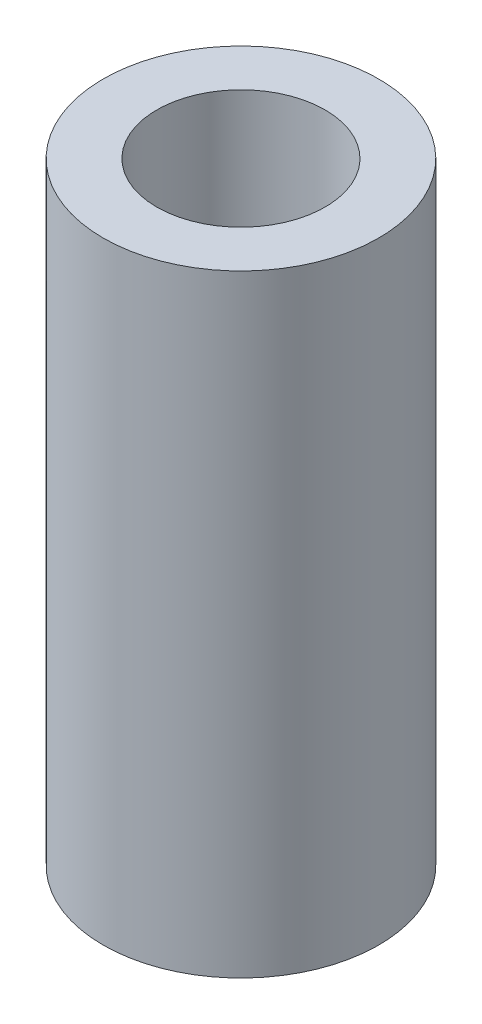
ISO-10303-21;
HEADER;
FILE_DESCRIPTION(('STEP AP214'),'2;1');
FILE_NAME('part.step','',(''),(''),'','','');
FILE_SCHEMA(('AUTOMOTIVE_DESIGN { 1 0 10303 214 1 1 1 1 }'));
ENDSEC;
DATA;
#1=APPLICATION_CONTEXT('core data for automotive mechanical design processes');
#2=APPLICATION_PROTOCOL_DEFINITION('international standard','automotive_design',2000,#1);
#3=PRODUCT_CONTEXT('',#1,'mechanical');
#4=PRODUCT('Part','Part','',(#3));
#5=PRODUCT_RELATED_PRODUCT_CATEGORY('part','',(#4));
#6=PRODUCT_DEFINITION_FORMATION('','',#4);
#7=PRODUCT_DEFINITION_CONTEXT('part definition',#1,'design');
#8=PRODUCT_DEFINITION('design','',#6,#7);
#9=PRODUCT_DEFINITION_SHAPE('','',#8);
#10=(LENGTH_UNIT() NAMED_UNIT(*) SI_UNIT(.MILLI.,.METRE.));
#11=(NAMED_UNIT(*) PLANE_ANGLE_UNIT() SI_UNIT($,.RADIAN.));
#12=(NAMED_UNIT(*) SI_UNIT($,.STERADIAN.) SOLID_ANGLE_UNIT());
#13=UNCERTAINTY_MEASURE_WITH_UNIT(LENGTH_MEASURE(1.E-05),#10,'distance_accuracy_value','');
#14=(GEOMETRIC_REPRESENTATION_CONTEXT(3) GLOBAL_UNCERTAINTY_ASSIGNED_CONTEXT((#13)) GLOBAL_UNIT_ASSIGNED_CONTEXT((#10,
#11,#12)) REPRESENTATION_CONTEXT('',''));
#15=CARTESIAN_POINT('',(0.,0.,0.));
#16=DIRECTION('',(0.,0.,1.));
#17=DIRECTION('',(1.,0.,0.));
#18=AXIS2_PLACEMENT_3D('',#15,#16,#17);
#19=CARTESIAN_POINT('',(20.65,50.4,20.7));
#20=DIRECTION('',(0.,1.,0.));
#21=DIRECTION('',(0.,0.,1.));
#22=AXIS2_PLACEMENT_3D('',#19,#20,#21);
#23=PLANE('',#22);
#24=CARTESIAN_POINT('',(20.65,50.4,20.7));
#25=DIRECTION('',(0.,1.,0.));
#26=DIRECTION('',(0.,0.,1.));
#27=AXIS2_PLACEMENT_3D('',#24,#25,#26);
#28=CIRCLE('',#27,4.5);
#29=CARTESIAN_POINT('',(20.65,50.4,25.2));
#30=VERTEX_POINT('',#29);
#31=EDGE_CURVE('E10',#30,#30,#28,.T.);
#32=ORIENTED_EDGE('',*,*,#31,.T.);
#33=EDGE_LOOP('',(#32));
#34=FACE_BOUND('',#33,.T.);
#35=CARTESIAN_POINT('',(20.65,50.4,20.7));
#36=DIRECTION('',(0.,1.,0.));
#37=DIRECTION('',(0.,0.,1.));
#38=AXIS2_PLACEMENT_3D('',#35,#36,#37);
#39=CIRCLE('',#38,2.75);
#40=CARTESIAN_POINT('',(20.65,50.4,23.45));
#41=VERTEX_POINT('',#40);
#42=EDGE_CURVE('E41',#41,#41,#39,.T.);
#43=ORIENTED_EDGE('',*,*,#42,.F.);
#44=EDGE_LOOP('',(#43));
#45=FACE_BOUND('',#44,.T.);
#46=ADVANCED_FACE('F30',(#34,#45),#23,.T.);
#47=CARTESIAN_POINT('',(20.65,30.4,20.7));
#48=DIRECTION('',(0.,1.,0.));
#49=DIRECTION('',(0.,0.,1.));
#50=AXIS2_PLACEMENT_3D('',#47,#48,#49);
#51=PLANE('',#50);
#52=CARTESIAN_POINT('',(20.65,30.4,20.7));
#53=DIRECTION('',(0.,1.,0.));
#54=DIRECTION('',(0.,0.,1.));
#55=AXIS2_PLACEMENT_3D('',#52,#53,#54);
#56=CIRCLE('',#55,4.5);
#57=CARTESIAN_POINT('',(20.65,30.4,25.2));
#58=VERTEX_POINT('',#57);
#59=EDGE_CURVE('E34',#58,#58,#56,.T.);
#60=ORIENTED_EDGE('',*,*,#59,.F.);
#61=EDGE_LOOP('',(#60));
#62=FACE_BOUND('',#61,.T.);
#63=CARTESIAN_POINT('',(20.65,30.4,20.7));
#64=DIRECTION('',(0.,1.,0.));
#65=DIRECTION('',(0.,0.,1.));
#66=AXIS2_PLACEMENT_3D('',#63,#64,#65);
#67=CIRCLE('',#66,2.75);
#68=CARTESIAN_POINT('',(20.65,30.4,23.45));
#69=VERTEX_POINT('',#68);
#70=EDGE_CURVE('E43',#69,#69,#67,.T.);
#71=ORIENTED_EDGE('',*,*,#70,.T.);
#72=EDGE_LOOP('',(#71));
#73=FACE_BOUND('',#72,.T.);
#74=ADVANCED_FACE('F53',(#62,#73),#51,.F.);
#75=CARTESIAN_POINT('',(20.65,50.4,20.7));
#76=DIRECTION('',(0.,-1.,0.));
#77=DIRECTION('',(0.,0.,-1.));
#78=AXIS2_PLACEMENT_3D('',#75,#76,#77);
#79=CYLINDRICAL_SURFACE('',#78,4.5);
#80=ORIENTED_EDGE('',*,*,#31,.F.);
#81=EDGE_LOOP('',(#80));
#82=FACE_BOUND('',#81,.T.);
#83=ORIENTED_EDGE('',*,*,#59,.T.);
#84=EDGE_LOOP('',(#83));
#85=FACE_BOUND('',#84,.T.);
#86=ADVANCED_FACE('F32',(#82,#85),#79,.T.);
#87=CARTESIAN_POINT('',(20.65,50.4,20.7));
#88=DIRECTION('',(0.,-1.,0.));
#89=DIRECTION('',(0.,0.,-1.));
#90=AXIS2_PLACEMENT_3D('',#87,#88,#89);
#91=CYLINDRICAL_SURFACE('',#90,2.75);
#92=ORIENTED_EDGE('',*,*,#42,.T.);
#93=EDGE_LOOP('',(#92));
#94=FACE_BOUND('',#93,.T.);
#95=ORIENTED_EDGE('',*,*,#70,.F.);
#96=EDGE_LOOP('',(#95));
#97=FACE_BOUND('',#96,.T.);
#98=ADVANCED_FACE('F49',(#94,#97),#91,.F.);
#99=CLOSED_SHELL('',(#46,#74,#86,#98));
#100=MANIFOLD_SOLID_BREP('B2',#99);
#101=ADVANCED_BREP_SHAPE_REPRESENTATION('',(#18,#100),#14);
#102=SHAPE_DEFINITION_REPRESENTATION(#9,#101);
ENDSEC;
END-ISO-10303-21;
